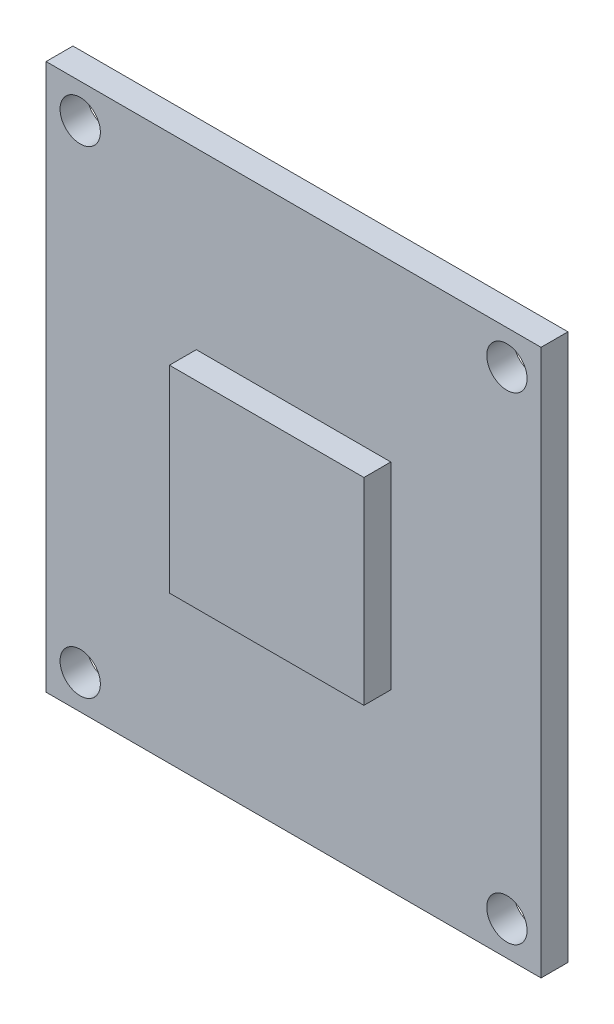
ISO-10303-21;
HEADER;
FILE_DESCRIPTION(('STEP AP214'),'2;1');
FILE_NAME('part.step','',(''),(''),'','','');
FILE_SCHEMA(('AUTOMOTIVE_DESIGN { 1 0 10303 214 1 1 1 1 }'));
ENDSEC;
DATA;
#1=APPLICATION_CONTEXT('core data for automotive mechanical design processes');
#2=APPLICATION_PROTOCOL_DEFINITION('international standard','automotive_design',2000,#1);
#3=PRODUCT_CONTEXT('',#1,'mechanical');
#4=PRODUCT('Part','Part','',(#3));
#5=PRODUCT_RELATED_PRODUCT_CATEGORY('part','',(#4));
#6=PRODUCT_DEFINITION_FORMATION('','',#4);
#7=PRODUCT_DEFINITION_CONTEXT('part definition',#1,'design');
#8=PRODUCT_DEFINITION('design','',#6,#7);
#9=PRODUCT_DEFINITION_SHAPE('','',#8);
#10=(LENGTH_UNIT() NAMED_UNIT(*) SI_UNIT(.MILLI.,.METRE.));
#11=(NAMED_UNIT(*) PLANE_ANGLE_UNIT() SI_UNIT($,.RADIAN.));
#12=(NAMED_UNIT(*) SI_UNIT($,.STERADIAN.) SOLID_ANGLE_UNIT());
#13=UNCERTAINTY_MEASURE_WITH_UNIT(LENGTH_MEASURE(1.E-05),#10,'distance_accuracy_value','');
#14=(GEOMETRIC_REPRESENTATION_CONTEXT(3) GLOBAL_UNCERTAINTY_ASSIGNED_CONTEXT((#13)) GLOBAL_UNIT_ASSIGNED_CONTEXT((#10,
#11,#12)) REPRESENTATION_CONTEXT('',''));
#15=CARTESIAN_POINT('',(0.,0.,0.));
#16=DIRECTION('',(0.,0.,1.));
#17=DIRECTION('',(1.,0.,0.));
#18=AXIS2_PLACEMENT_3D('',#15,#16,#17);
#19=CARTESIAN_POINT('',(0.,0.,2.));
#20=DIRECTION('',(0.,0.,-1.));
#21=DIRECTION('',(-1.,0.,0.));
#22=AXIS2_PLACEMENT_3D('',#19,#20,#21);
#23=PLANE('',#22);
#24=CARTESIAN_POINT('',(15.875,-17.78,2.));
#25=DIRECTION('',(0.,0.,1.));
#26=DIRECTION('',(1.,0.,0.));
#27=AXIS2_PLACEMENT_3D('',#24,#25,#26);
#28=CIRCLE('',#27,1.5);
#29=CARTESIAN_POINT('',(17.375,-17.78,2.));
#30=VERTEX_POINT('',#29);
#31=EDGE_CURVE('E131',#30,#30,#28,.T.);
#32=ORIENTED_EDGE('',*,*,#31,.F.);
#33=EDGE_LOOP('',(#32));
#34=FACE_BOUND('',#33,.T.);
#35=CARTESIAN_POINT('',(-15.875,-17.78,2.));
#36=DIRECTION('',(0.,0.,1.));
#37=DIRECTION('',(1.,0.,0.));
#38=AXIS2_PLACEMENT_3D('',#35,#36,#37);
#39=CIRCLE('',#38,1.5);
#40=CARTESIAN_POINT('',(-14.375,-17.78,2.));
#41=VERTEX_POINT('',#40);
#42=EDGE_CURVE('E140',#41,#41,#39,.T.);
#43=ORIENTED_EDGE('',*,*,#42,.F.);
#44=EDGE_LOOP('',(#43));
#45=FACE_BOUND('',#44,.T.);
#46=CARTESIAN_POINT('',(15.875,17.78,2.));
#47=DIRECTION('',(0.,0.,1.));
#48=DIRECTION('',(1.,0.,0.));
#49=AXIS2_PLACEMENT_3D('',#46,#47,#48);
#50=CIRCLE('',#49,1.5);
#51=CARTESIAN_POINT('',(17.375,17.78,2.));
#52=VERTEX_POINT('',#51);
#53=EDGE_CURVE('E146',#52,#52,#50,.T.);
#54=ORIENTED_EDGE('',*,*,#53,.F.);
#55=EDGE_LOOP('',(#54));
#56=FACE_BOUND('',#55,.T.);
#57=CARTESIAN_POINT('',(-15.875,17.78,2.));
#58=DIRECTION('',(0.,0.,1.));
#59=DIRECTION('',(1.,0.,0.));
#60=AXIS2_PLACEMENT_3D('',#57,#58,#59);
#61=CIRCLE('',#60,1.5);
#62=CARTESIAN_POINT('',(-14.375,17.78,2.));
#63=VERTEX_POINT('',#62);
#64=EDGE_CURVE('E152',#63,#63,#61,.T.);
#65=ORIENTED_EDGE('',*,*,#64,.F.);
#66=EDGE_LOOP('',(#65));
#67=FACE_BOUND('',#66,.T.);
#68=DIRECTION('',(0.,1.,0.));
#69=VECTOR('',#68,1.);
#70=CARTESIAN_POINT('',(18.415,-20.32,2.));
#71=LINE('',#70,#69);
#72=CARTESIAN_POINT('',(18.415,-20.32,2.));
#73=VERTEX_POINT('',#72);
#74=CARTESIAN_POINT('',(18.415,20.32,2.));
#75=VERTEX_POINT('',#74);
#76=EDGE_CURVE('E158',#73,#75,#71,.T.);
#77=ORIENTED_EDGE('',*,*,#76,.T.);
#78=DIRECTION('',(-1.,0.,0.));
#79=VECTOR('',#78,1.);
#80=CARTESIAN_POINT('',(-18.415,20.32,2.));
#81=LINE('',#80,#79);
#82=CARTESIAN_POINT('',(-18.415,20.32,2.));
#83=VERTEX_POINT('',#82);
#84=EDGE_CURVE('E161',#75,#83,#81,.T.);
#85=ORIENTED_EDGE('',*,*,#84,.T.);
#86=DIRECTION('',(0.,-1.,0.));
#87=VECTOR('',#86,1.);
#88=CARTESIAN_POINT('',(-18.415,-20.32,2.));
#89=LINE('',#88,#87);
#90=CARTESIAN_POINT('',(-18.415,-20.32,2.));
#91=VERTEX_POINT('',#90);
#92=EDGE_CURVE('E164',#83,#91,#89,.T.);
#93=ORIENTED_EDGE('',*,*,#92,.T.);
#94=DIRECTION('',(1.,0.,0.));
#95=VECTOR('',#94,1.);
#96=CARTESIAN_POINT('',(-18.415,-20.32,2.));
#97=LINE('',#96,#95);
#98=EDGE_CURVE('E166',#91,#73,#97,.T.);
#99=ORIENTED_EDGE('',*,*,#98,.T.);
#100=EDGE_LOOP('',(#77,#85,#93,#99));
#101=FACE_BOUND('',#100,.T.);
#102=DIRECTION('',(0.,1.,0.));
#103=VECTOR('',#102,1.);
#104=CARTESIAN_POINT('',(7.23552937326134,7.34193421698576,2.));
#105=LINE('',#104,#103);
#106=CARTESIAN_POINT('',(7.23552937326134,-7.34193421698576,2.));
#107=VERTEX_POINT('',#106);
#108=CARTESIAN_POINT('',(7.23552937326134,7.34193421698576,2.));
#109=VERTEX_POINT('',#108);
#110=EDGE_CURVE('E58',#107,#109,#105,.T.);
#111=ORIENTED_EDGE('',*,*,#110,.F.);
#112=DIRECTION('',(1.,0.,0.));
#113=VECTOR('',#112,1.);
#114=CARTESIAN_POINT('',(-7.23552937326134,-7.34193421698576,2.));
#115=LINE('',#114,#113);
#116=CARTESIAN_POINT('',(-7.23552937326134,-7.34193421698576,2.));
#117=VERTEX_POINT('',#116);
#118=EDGE_CURVE('E62',#117,#107,#115,.T.);
#119=ORIENTED_EDGE('',*,*,#118,.F.);
#120=DIRECTION('',(0.,-1.,0.));
#121=VECTOR('',#120,1.);
#122=CARTESIAN_POINT('',(-7.23552937326134,7.34193421698576,2.));
#123=LINE('',#122,#121);
#124=CARTESIAN_POINT('',(-7.23552937326134,7.34193421698576,2.));
#125=VERTEX_POINT('',#124);
#126=EDGE_CURVE('E385',#125,#117,#123,.T.);
#127=ORIENTED_EDGE('',*,*,#126,.F.);
#128=DIRECTION('',(-1.,0.,0.));
#129=VECTOR('',#128,1.);
#130=CARTESIAN_POINT('',(-7.23552937326134,7.34193421698576,2.));
#131=LINE('',#130,#129);
#132=EDGE_CURVE('E391',#109,#125,#131,.T.);
#133=ORIENTED_EDGE('',*,*,#132,.F.);
#134=EDGE_LOOP('',(#111,#119,#127,#133));
#135=FACE_BOUND('',#134,.T.);
#136=ADVANCED_FACE('F43',(#34,#45,#56,#67,#101,#135),#23,.F.);
#137=CARTESIAN_POINT('',(0.,0.,0.));
#138=DIRECTION('',(0.,0.,-1.));
#139=DIRECTION('',(-1.,0.,0.));
#140=AXIS2_PLACEMENT_3D('',#137,#138,#139);
#141=PLANE('',#140);
#142=CARTESIAN_POINT('',(-15.875,-17.78,0.));
#143=DIRECTION('',(0.,0.,1.));
#144=DIRECTION('',(1.,0.,0.));
#145=AXIS2_PLACEMENT_3D('',#142,#143,#144);
#146=CIRCLE('',#145,1.5);
#147=CARTESIAN_POINT('',(-14.375,-17.78,0.));
#148=VERTEX_POINT('',#147);
#149=EDGE_CURVE('E138',#148,#148,#146,.T.);
#150=ORIENTED_EDGE('',*,*,#149,.T.);
#151=EDGE_LOOP('',(#150));
#152=FACE_BOUND('',#151,.T.);
#153=CARTESIAN_POINT('',(-15.875,17.78,0.));
#154=DIRECTION('',(0.,0.,1.));
#155=DIRECTION('',(1.,0.,0.));
#156=AXIS2_PLACEMENT_3D('',#153,#154,#155);
#157=CIRCLE('',#156,1.5);
#158=CARTESIAN_POINT('',(-14.375,17.78,0.));
#159=VERTEX_POINT('',#158);
#160=EDGE_CURVE('E149',#159,#159,#157,.T.);
#161=ORIENTED_EDGE('',*,*,#160,.T.);
#162=EDGE_LOOP('',(#161));
#163=FACE_BOUND('',#162,.T.);
#164=DIRECTION('',(0.,1.,0.));
#165=VECTOR('',#164,1.);
#166=CARTESIAN_POINT('',(18.415,-20.32,0.));
#167=LINE('',#166,#165);
#168=CARTESIAN_POINT('',(18.415,-20.32,0.));
#169=VERTEX_POINT('',#168);
#170=CARTESIAN_POINT('',(18.415,20.32,0.));
#171=VERTEX_POINT('',#170);
#172=EDGE_CURVE('E155',#169,#171,#167,.T.);
#173=ORIENTED_EDGE('',*,*,#172,.F.);
#174=DIRECTION('',(1.,0.,0.));
#175=VECTOR('',#174,1.);
#176=CARTESIAN_POINT('',(-18.415,-20.32,0.));
#177=LINE('',#176,#175);
#178=CARTESIAN_POINT('',(-18.415,-20.32,0.));
#179=VERTEX_POINT('',#178);
#180=EDGE_CURVE('E162',#179,#169,#177,.T.);
#181=ORIENTED_EDGE('',*,*,#180,.F.);
#182=DIRECTION('',(0.,-1.,0.));
#183=VECTOR('',#182,1.);
#184=CARTESIAN_POINT('',(-18.415,-20.32,0.));
#185=LINE('',#184,#183);
#186=CARTESIAN_POINT('',(-18.415,20.32,0.));
#187=VERTEX_POINT('',#186);
#188=EDGE_CURVE('E173',#187,#179,#185,.T.);
#189=ORIENTED_EDGE('',*,*,#188,.F.);
#190=DIRECTION('',(-1.,0.,0.));
#191=VECTOR('',#190,1.);
#192=CARTESIAN_POINT('',(-18.415,20.32,0.));
#193=LINE('',#192,#191);
#194=EDGE_CURVE('E171',#171,#187,#193,.T.);
#195=ORIENTED_EDGE('',*,*,#194,.F.);
#196=EDGE_LOOP('',(#173,#181,#189,#195));
#197=FACE_BOUND('',#196,.T.);
#198=CARTESIAN_POINT('',(15.875,17.78,0.));
#199=DIRECTION('',(0.,0.,1.));
#200=DIRECTION('',(1.,0.,0.));
#201=AXIS2_PLACEMENT_3D('',#198,#199,#200);
#202=CIRCLE('',#201,1.5);
#203=CARTESIAN_POINT('',(17.375,17.78,0.));
#204=VERTEX_POINT('',#203);
#205=EDGE_CURVE('E143',#204,#204,#202,.T.);
#206=ORIENTED_EDGE('',*,*,#205,.T.);
#207=EDGE_LOOP('',(#206));
#208=FACE_BOUND('',#207,.T.);
#209=CARTESIAN_POINT('',(15.875,-17.78,0.));
#210=DIRECTION('',(0.,0.,1.));
#211=DIRECTION('',(1.,0.,0.));
#212=AXIS2_PLACEMENT_3D('',#209,#210,#211);
#213=CIRCLE('',#212,1.5);
#214=CARTESIAN_POINT('',(17.375,-17.78,0.));
#215=VERTEX_POINT('',#214);
#216=EDGE_CURVE('E128',#215,#215,#213,.T.);
#217=ORIENTED_EDGE('',*,*,#216,.T.);
#218=EDGE_LOOP('',(#217));
#219=FACE_BOUND('',#218,.T.);
#220=ADVANCED_FACE('F191',(#152,#163,#197,#208,#219),#141,.T.);
#221=CARTESIAN_POINT('',(18.415,-20.32,2.));
#222=DIRECTION('',(-1.,0.,0.));
#223=DIRECTION('',(0.,0.,1.));
#224=AXIS2_PLACEMENT_3D('',#221,#222,#223);
#225=PLANE('',#224);
#226=ORIENTED_EDGE('',*,*,#172,.T.);
#227=DIRECTION('',(0.,0.,-1.));
#228=VECTOR('',#227,1.);
#229=CARTESIAN_POINT('',(18.415,20.32,2.));
#230=LINE('',#229,#228);
#231=EDGE_CURVE('E11',#75,#171,#230,.T.);
#232=ORIENTED_EDGE('',*,*,#231,.F.);
#233=ORIENTED_EDGE('',*,*,#76,.F.);
#234=DIRECTION('',(0.,0.,-1.));
#235=VECTOR('',#234,1.);
#236=CARTESIAN_POINT('',(18.415,-20.32,2.));
#237=LINE('',#236,#235);
#238=EDGE_CURVE('E168',#73,#169,#237,.T.);
#239=ORIENTED_EDGE('',*,*,#238,.T.);
#240=EDGE_LOOP('',(#226,#232,#233,#239));
#241=FACE_BOUND('',#240,.T.);
#242=ADVANCED_FACE('F45',(#241),#225,.F.);
#243=CARTESIAN_POINT('',(-18.415,20.32,2.));
#244=DIRECTION('',(0.,-1.,0.));
#245=DIRECTION('',(0.,0.,-1.));
#246=AXIS2_PLACEMENT_3D('',#243,#244,#245);
#247=PLANE('',#246);
#248=ORIENTED_EDGE('',*,*,#194,.T.);
#249=DIRECTION('',(0.,0.,-1.));
#250=VECTOR('',#249,1.);
#251=CARTESIAN_POINT('',(-18.415,20.32,2.));
#252=LINE('',#251,#250);
#253=EDGE_CURVE('E51',#83,#187,#252,.T.);
#254=ORIENTED_EDGE('',*,*,#253,.F.);
#255=ORIENTED_EDGE('',*,*,#84,.F.);
#256=ORIENTED_EDGE('',*,*,#231,.T.);
#257=EDGE_LOOP('',(#248,#254,#255,#256));
#258=FACE_BOUND('',#257,.T.);
#259=ADVANCED_FACE('F201',(#258),#247,.F.);
#260=CARTESIAN_POINT('',(-18.415,-20.32,2.));
#261=DIRECTION('',(1.,0.,0.));
#262=DIRECTION('',(0.,0.,-1.));
#263=AXIS2_PLACEMENT_3D('',#260,#261,#262);
#264=PLANE('',#263);
#265=ORIENTED_EDGE('',*,*,#188,.T.);
#266=DIRECTION('',(0.,0.,-1.));
#267=VECTOR('',#266,1.);
#268=CARTESIAN_POINT('',(-18.415,-20.32,2.));
#269=LINE('',#268,#267);
#270=EDGE_CURVE('E178',#91,#179,#269,.T.);
#271=ORIENTED_EDGE('',*,*,#270,.F.);
#272=ORIENTED_EDGE('',*,*,#92,.F.);
#273=ORIENTED_EDGE('',*,*,#253,.T.);
#274=EDGE_LOOP('',(#265,#271,#272,#273));
#275=FACE_BOUND('',#274,.T.);
#276=ADVANCED_FACE('F185',(#275),#264,.F.);
#277=CARTESIAN_POINT('',(-18.415,-20.32,2.));
#278=DIRECTION('',(0.,1.,0.));
#279=DIRECTION('',(0.,0.,1.));
#280=AXIS2_PLACEMENT_3D('',#277,#278,#279);
#281=PLANE('',#280);
#282=ORIENTED_EDGE('',*,*,#180,.T.);
#283=ORIENTED_EDGE('',*,*,#238,.F.);
#284=ORIENTED_EDGE('',*,*,#98,.F.);
#285=ORIENTED_EDGE('',*,*,#270,.T.);
#286=EDGE_LOOP('',(#282,#283,#284,#285));
#287=FACE_BOUND('',#286,.T.);
#288=ADVANCED_FACE('F195',(#287),#281,.F.);
#289=CARTESIAN_POINT('',(-15.875,17.78,2.));
#290=DIRECTION('',(0.,0.,-1.));
#291=DIRECTION('',(-1.,0.,0.));
#292=AXIS2_PLACEMENT_3D('',#289,#290,#291);
#293=CYLINDRICAL_SURFACE('',#292,1.5);
#294=ORIENTED_EDGE('',*,*,#64,.T.);
#295=EDGE_LOOP('',(#294));
#296=FACE_BOUND('',#295,.T.);
#297=ORIENTED_EDGE('',*,*,#160,.F.);
#298=EDGE_LOOP('',(#297));
#299=FACE_BOUND('',#298,.T.);
#300=ADVANCED_FACE('F219',(#296,#299),#293,.F.);
#301=CARTESIAN_POINT('',(15.875,17.78,2.));
#302=DIRECTION('',(0.,0.,-1.));
#303=DIRECTION('',(-1.,0.,0.));
#304=AXIS2_PLACEMENT_3D('',#301,#302,#303);
#305=CYLINDRICAL_SURFACE('',#304,1.5);
#306=ORIENTED_EDGE('',*,*,#53,.T.);
#307=EDGE_LOOP('',(#306));
#308=FACE_BOUND('',#307,.T.);
#309=ORIENTED_EDGE('',*,*,#205,.F.);
#310=EDGE_LOOP('',(#309));
#311=FACE_BOUND('',#310,.T.);
#312=ADVANCED_FACE('F226',(#308,#311),#305,.F.);
#313=CARTESIAN_POINT('',(-15.875,-17.78,2.));
#314=DIRECTION('',(0.,0.,-1.));
#315=DIRECTION('',(-1.,0.,0.));
#316=AXIS2_PLACEMENT_3D('',#313,#314,#315);
#317=CYLINDRICAL_SURFACE('',#316,1.5);
#318=ORIENTED_EDGE('',*,*,#42,.T.);
#319=EDGE_LOOP('',(#318));
#320=FACE_BOUND('',#319,.T.);
#321=ORIENTED_EDGE('',*,*,#149,.F.);
#322=EDGE_LOOP('',(#321));
#323=FACE_BOUND('',#322,.T.);
#324=ADVANCED_FACE('F231',(#320,#323),#317,.F.);
#325=CARTESIAN_POINT('',(15.875,-17.78,2.));
#326=DIRECTION('',(0.,0.,-1.));
#327=DIRECTION('',(-1.,0.,0.));
#328=AXIS2_PLACEMENT_3D('',#325,#326,#327);
#329=CYLINDRICAL_SURFACE('',#328,1.5);
#330=ORIENTED_EDGE('',*,*,#31,.T.);
#331=EDGE_LOOP('',(#330));
#332=FACE_BOUND('',#331,.T.);
#333=ORIENTED_EDGE('',*,*,#216,.F.);
#334=EDGE_LOOP('',(#333));
#335=FACE_BOUND('',#334,.T.);
#336=ADVANCED_FACE('F241',(#332,#335),#329,.F.);
#337=CARTESIAN_POINT('',(7.23552937326134,7.34193421698576,4.));
#338=DIRECTION('',(-1.,0.,0.));
#339=DIRECTION('',(0.,0.,1.));
#340=AXIS2_PLACEMENT_3D('',#337,#338,#339);
#341=PLANE('',#340);
#342=ORIENTED_EDGE('',*,*,#110,.T.);
#343=DIRECTION('',(0.,0.,-1.));
#344=VECTOR('',#343,1.);
#345=CARTESIAN_POINT('',(7.23552937326134,7.34193421698576,4.));
#346=LINE('',#345,#344);
#347=CARTESIAN_POINT('',(7.23552937326134,7.34193421698576,4.));
#348=VERTEX_POINT('',#347);
#349=EDGE_CURVE('E111',#348,#109,#346,.T.);
#350=ORIENTED_EDGE('',*,*,#349,.F.);
#351=DIRECTION('',(0.,1.,0.));
#352=VECTOR('',#351,1.);
#353=CARTESIAN_POINT('',(7.23552937326134,7.34193421698576,4.));
#354=LINE('',#353,#352);
#355=CARTESIAN_POINT('',(7.23552937326134,-7.34193421698576,4.));
#356=VERTEX_POINT('',#355);
#357=EDGE_CURVE('E117',#356,#348,#354,.T.);
#358=ORIENTED_EDGE('',*,*,#357,.F.);
#359=DIRECTION('',(0.,0.,-1.));
#360=VECTOR('',#359,1.);
#361=CARTESIAN_POINT('',(7.23552937326134,-7.34193421698576,4.));
#362=LINE('',#361,#360);
#363=EDGE_CURVE('E383',#356,#107,#362,.T.);
#364=ORIENTED_EDGE('',*,*,#363,.T.);
#365=EDGE_LOOP('',(#342,#350,#358,#364));
#366=FACE_BOUND('',#365,.T.);
#367=ADVANCED_FACE('F127',(#366),#341,.F.);
#368=CARTESIAN_POINT('',(-7.23552937326134,7.34193421698576,4.));
#369=DIRECTION('',(0.,-1.,0.));
#370=DIRECTION('',(0.,0.,-1.));
#371=AXIS2_PLACEMENT_3D('',#368,#369,#370);
#372=PLANE('',#371);
#373=ORIENTED_EDGE('',*,*,#132,.T.);
#374=DIRECTION('',(0.,0.,-1.));
#375=VECTOR('',#374,1.);
#376=CARTESIAN_POINT('',(-7.23552937326134,7.34193421698576,4.));
#377=LINE('',#376,#375);
#378=CARTESIAN_POINT('',(-7.23552937326134,7.34193421698576,4.));
#379=VERTEX_POINT('',#378);
#380=EDGE_CURVE('E113',#379,#125,#377,.T.);
#381=ORIENTED_EDGE('',*,*,#380,.F.);
#382=DIRECTION('',(-1.,0.,0.));
#383=VECTOR('',#382,1.);
#384=CARTESIAN_POINT('',(-7.23552937326134,7.34193421698576,4.));
#385=LINE('',#384,#383);
#386=EDGE_CURVE('E106',#348,#379,#385,.T.);
#387=ORIENTED_EDGE('',*,*,#386,.F.);
#388=ORIENTED_EDGE('',*,*,#349,.T.);
#389=EDGE_LOOP('',(#373,#381,#387,#388));
#390=FACE_BOUND('',#389,.T.);
#391=ADVANCED_FACE('F109',(#390),#372,.F.);
#392=CARTESIAN_POINT('',(-7.23552937326134,7.34193421698576,4.));
#393=DIRECTION('',(1.,0.,0.));
#394=DIRECTION('',(0.,0.,-1.));
#395=AXIS2_PLACEMENT_3D('',#392,#393,#394);
#396=PLANE('',#395);
#397=ORIENTED_EDGE('',*,*,#126,.T.);
#398=DIRECTION('',(0.,0.,-1.));
#399=VECTOR('',#398,1.);
#400=CARTESIAN_POINT('',(-7.23552937326134,-7.34193421698576,4.));
#401=LINE('',#400,#399);
#402=CARTESIAN_POINT('',(-7.23552937326134,-7.34193421698576,4.));
#403=VERTEX_POINT('',#402);
#404=EDGE_CURVE('E133',#403,#117,#401,.T.);
#405=ORIENTED_EDGE('',*,*,#404,.F.);
#406=DIRECTION('',(0.,-1.,0.));
#407=VECTOR('',#406,1.);
#408=CARTESIAN_POINT('',(-7.23552937326134,7.34193421698576,4.));
#409=LINE('',#408,#407);
#410=EDGE_CURVE('E116',#379,#403,#409,.T.);
#411=ORIENTED_EDGE('',*,*,#410,.F.);
#412=ORIENTED_EDGE('',*,*,#380,.T.);
#413=EDGE_LOOP('',(#397,#405,#411,#412));
#414=FACE_BOUND('',#413,.T.);
#415=ADVANCED_FACE('F253',(#414),#396,.F.);
#416=CARTESIAN_POINT('',(-7.23552937326134,-7.34193421698576,4.));
#417=DIRECTION('',(0.,1.,0.));
#418=DIRECTION('',(0.,0.,1.));
#419=AXIS2_PLACEMENT_3D('',#416,#417,#418);
#420=PLANE('',#419);
#421=ORIENTED_EDGE('',*,*,#118,.T.);
#422=ORIENTED_EDGE('',*,*,#363,.F.);
#423=DIRECTION('',(1.,0.,0.));
#424=VECTOR('',#423,1.);
#425=CARTESIAN_POINT('',(-7.23552937326134,-7.34193421698576,4.));
#426=LINE('',#425,#424);
#427=EDGE_CURVE('E122',#403,#356,#426,.T.);
#428=ORIENTED_EDGE('',*,*,#427,.F.);
#429=ORIENTED_EDGE('',*,*,#404,.T.);
#430=EDGE_LOOP('',(#421,#422,#428,#429));
#431=FACE_BOUND('',#430,.T.);
#432=ADVANCED_FACE('F256',(#431),#420,.F.);
#433=CARTESIAN_POINT('',(0.,0.,4.));
#434=DIRECTION('',(0.,0.,1.));
#435=DIRECTION('',(1.,0.,0.));
#436=AXIS2_PLACEMENT_3D('',#433,#434,#435);
#437=PLANE('',#436);
#438=ORIENTED_EDGE('',*,*,#357,.T.);
#439=ORIENTED_EDGE('',*,*,#386,.T.);
#440=ORIENTED_EDGE('',*,*,#410,.T.);
#441=ORIENTED_EDGE('',*,*,#427,.T.);
#442=EDGE_LOOP('',(#438,#439,#440,#441));
#443=FACE_BOUND('',#442,.T.);
#444=ADVANCED_FACE('F120',(#443),#437,.T.);
#445=CLOSED_SHELL('',(#136,#220,#242,#259,#276,#288,#300,#312,#324,#336,#367,#391,#415,#432,#444));
#446=MANIFOLD_SOLID_BREP('B2',#445);
#447=ADVANCED_BREP_SHAPE_REPRESENTATION('',(#18,#446),#14);
#448=SHAPE_DEFINITION_REPRESENTATION(#9,#447);
ENDSEC;
END-ISO-10303-21;
